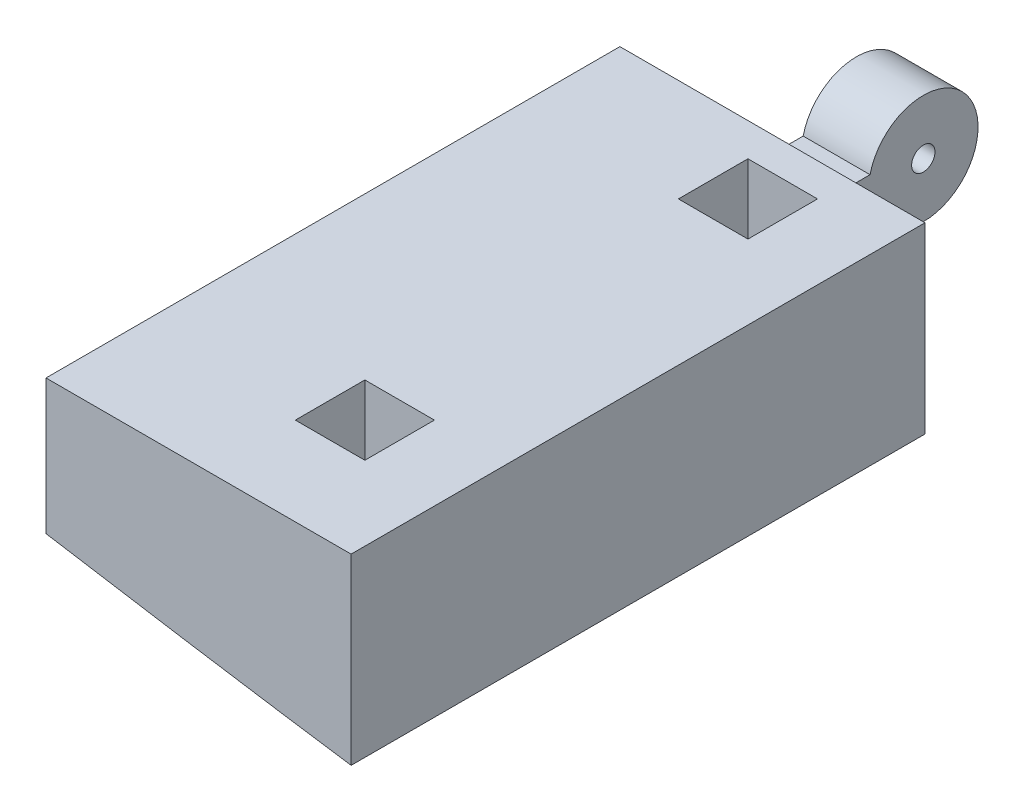
ISO-10303-21;
HEADER;
FILE_DESCRIPTION(('STEP AP214'),'2;1');
FILE_NAME('part.step','',(''),(''),'','','');
FILE_SCHEMA(('AUTOMOTIVE_DESIGN { 1 0 10303 214 1 1 1 1 }'));
ENDSEC;
DATA;
#1=APPLICATION_CONTEXT('core data for automotive mechanical design processes');
#2=APPLICATION_PROTOCOL_DEFINITION('international standard','automotive_design',2000,#1);
#3=PRODUCT_CONTEXT('',#1,'mechanical');
#4=PRODUCT('Part','Part','',(#3));
#5=PRODUCT_RELATED_PRODUCT_CATEGORY('part','',(#4));
#6=PRODUCT_DEFINITION_FORMATION('','',#4);
#7=PRODUCT_DEFINITION_CONTEXT('part definition',#1,'design');
#8=PRODUCT_DEFINITION('design','',#6,#7);
#9=PRODUCT_DEFINITION_SHAPE('','',#8);
#10=(LENGTH_UNIT() NAMED_UNIT(*) SI_UNIT(.MILLI.,.METRE.));
#11=(NAMED_UNIT(*) PLANE_ANGLE_UNIT() SI_UNIT($,.RADIAN.));
#12=(NAMED_UNIT(*) SI_UNIT($,.STERADIAN.) SOLID_ANGLE_UNIT());
#13=UNCERTAINTY_MEASURE_WITH_UNIT(LENGTH_MEASURE(1.E-05),#10,'distance_accuracy_value','');
#14=(GEOMETRIC_REPRESENTATION_CONTEXT(3) GLOBAL_UNCERTAINTY_ASSIGNED_CONTEXT((#13)) GLOBAL_UNIT_ASSIGNED_CONTEXT((#10,
#11,#12)) REPRESENTATION_CONTEXT('',''));
#15=CARTESIAN_POINT('',(0.,0.,0.));
#16=DIRECTION('',(0.,0.,1.));
#17=DIRECTION('',(1.,0.,0.));
#18=AXIS2_PLACEMENT_3D('',#15,#16,#17);
#19=CARTESIAN_POINT('',(0.,12.7,0.));
#20=DIRECTION('',(0.,1.,0.));
#21=DIRECTION('',(0.,0.,1.));
#22=AXIS2_PLACEMENT_3D('',#19,#20,#21);
#23=PLANE('',#22);
#24=DIRECTION('',(0.,0.,1.));
#25=VECTOR('',#24,1.);
#26=CARTESIAN_POINT('',(-137.2215,12.7,45.7452478));
#27=LINE('',#26,#25);
#28=CARTESIAN_POINT('',(-137.2215,12.7,39.1952478));
#29=VERTEX_POINT('',#28);
#30=CARTESIAN_POINT('',(-137.2215,12.7,45.7452478));
#31=VERTEX_POINT('',#30);
#32=EDGE_CURVE('E230',#29,#31,#27,.T.);
#33=ORIENTED_EDGE('',*,*,#32,.F.);
#34=DIRECTION('',(-1.,0.,0.));
#35=VECTOR('',#34,1.);
#36=CARTESIAN_POINT('',(-137.2215,12.7,39.1952478));
#37=LINE('',#36,#35);
#38=CARTESIAN_POINT('',(-130.6715,12.7,39.1952478));
#39=VERTEX_POINT('',#38);
#40=EDGE_CURVE('E632',#39,#29,#37,.T.);
#41=ORIENTED_EDGE('',*,*,#40,.F.);
#42=DIRECTION('',(0.,0.,-1.));
#43=VECTOR('',#42,1.);
#44=CARTESIAN_POINT('',(-130.6715,12.7,39.1952478));
#45=LINE('',#44,#43);
#46=CARTESIAN_POINT('',(-130.6715,12.7,45.7452478));
#47=VERTEX_POINT('',#46);
#48=EDGE_CURVE('E627',#47,#39,#45,.T.);
#49=ORIENTED_EDGE('',*,*,#48,.F.);
#50=DIRECTION('',(1.,0.,0.));
#51=VECTOR('',#50,1.);
#52=CARTESIAN_POINT('',(-130.6715,12.7,45.7452478));
#53=LINE('',#52,#51);
#54=EDGE_CURVE('E622',#31,#47,#53,.T.);
#55=ORIENTED_EDGE('',*,*,#54,.F.);
#56=EDGE_LOOP('',(#33,#41,#49,#55));
#57=FACE_BOUND('',#56,.T.);
#58=DIRECTION('',(0.,0.,1.));
#59=VECTOR('',#58,1.);
#60=CARTESIAN_POINT('',(-137.2215,12.7,9.6673926));
#61=LINE('',#60,#59);
#62=CARTESIAN_POINT('',(-137.2215,12.7,3.11739259999999));
#63=VERTEX_POINT('',#62);
#64=CARTESIAN_POINT('',(-137.2215,12.7,9.6673926));
#65=VERTEX_POINT('',#64);
#66=EDGE_CURVE('E99',#63,#65,#61,.T.);
#67=ORIENTED_EDGE('',*,*,#66,.F.);
#68=DIRECTION('',(-1.,0.,0.));
#69=VECTOR('',#68,1.);
#70=CARTESIAN_POINT('',(-137.2215,12.7,3.11739259999999));
#71=LINE('',#70,#69);
#72=CARTESIAN_POINT('',(-130.6715,12.7,3.11739259999999));
#73=VERTEX_POINT('',#72);
#74=EDGE_CURVE('E178',#73,#63,#71,.T.);
#75=ORIENTED_EDGE('',*,*,#74,.F.);
#76=DIRECTION('',(0.,0.,-1.));
#77=VECTOR('',#76,1.);
#78=CARTESIAN_POINT('',(-130.6715,12.7,3.11739259999999));
#79=LINE('',#78,#77);
#80=CARTESIAN_POINT('',(-130.6715,12.7,9.6673926));
#81=VERTEX_POINT('',#80);
#82=EDGE_CURVE('E614',#81,#73,#79,.T.);
#83=ORIENTED_EDGE('',*,*,#82,.F.);
#84=DIRECTION('',(1.,0.,0.));
#85=VECTOR('',#84,1.);
#86=CARTESIAN_POINT('',(-130.6715,12.7,9.6673926));
#87=LINE('',#86,#85);
#88=EDGE_CURVE('E595',#65,#81,#87,.T.);
#89=ORIENTED_EDGE('',*,*,#88,.F.);
#90=EDGE_LOOP('',(#67,#75,#83,#89));
#91=FACE_BOUND('',#90,.T.);
#92=DIRECTION('',(1.,0.,0.));
#93=VECTOR('',#92,1.);
#94=CARTESIAN_POINT('',(-159.010895789948,12.7,54.0463755324926));
#95=LINE('',#94,#93);
#96=CARTESIAN_POINT('',(-152.4,12.7,54.0463755324926));
#97=VERTEX_POINT('',#96);
#98=CARTESIAN_POINT('',(-123.666050737662,12.7,54.0463755324926));
#99=VERTEX_POINT('',#98);
#100=EDGE_CURVE('E42',#97,#99,#95,.T.);
#101=ORIENTED_EDGE('',*,*,#100,.T.);
#102=DIRECTION('',(0.,0.,-1.));
#103=VECTOR('',#102,1.);
#104=CARTESIAN_POINT('',(-123.666050737662,12.7,-20.9889922424434));
#105=LINE('',#104,#103);
#106=CARTESIAN_POINT('',(-123.666050737662,12.7,0.));
#107=VERTEX_POINT('',#106);
#108=EDGE_CURVE('E199',#99,#107,#105,.T.);
#109=ORIENTED_EDGE('',*,*,#108,.T.);
#110=DIRECTION('',(-1.,0.,0.));
#111=VECTOR('',#110,1.);
#112=CARTESIAN_POINT('',(0.,12.7,0.));
#113=LINE('',#112,#111);
#114=CARTESIAN_POINT('',(-152.4,12.7,0.));
#115=VERTEX_POINT('',#114);
#116=EDGE_CURVE('E200',#107,#115,#113,.T.);
#117=ORIENTED_EDGE('',*,*,#116,.T.);
#118=DIRECTION('',(0.,0.,1.));
#119=VECTOR('',#118,1.);
#120=CARTESIAN_POINT('',(-152.4,12.7,0.));
#121=LINE('',#120,#119);
#122=EDGE_CURVE('E203',#115,#97,#121,.T.);
#123=ORIENTED_EDGE('',*,*,#122,.T.);
#124=EDGE_LOOP('',(#101,#109,#117,#123));
#125=FACE_BOUND('',#124,.T.);
#126=ADVANCED_FACE('F38',(#57,#91,#125),#23,.T.);
#127=CARTESIAN_POINT('',(0.,12.7,0.));
#128=DIRECTION('',(0.,0.,1.));
#129=DIRECTION('',(1.,0.,0.));
#130=AXIS2_PLACEMENT_3D('',#127,#128,#129);
#131=PLANE('',#130);
#132=CARTESIAN_POINT('',(0.,0.,0.));
#133=CARTESIAN_POINT('',(-152.4,0.,0.));
#134=B_SPLINE_CURVE_WITH_KNOTS('',1,(#132,#133),.UNSPECIFIED.,.F.,.F.,(2,2),(0.,1.),.UNSPECIFIED.);
#135=CARTESIAN_POINT('',(-134.9375,0.,0.));
#136=VERTEX_POINT('',#135);
#137=CARTESIAN_POINT('',(-144.4125,0.,0.));
#138=VERTEX_POINT('',#137);
#139=EDGE_CURVE('E234',#136,#138,#134,.T.);
#140=ORIENTED_EDGE('',*,*,#139,.F.);
#141=DIRECTION('',(0.,-1.,0.));
#142=VECTOR('',#141,1.);
#143=CARTESIAN_POINT('',(-134.9375,12.7,0.));
#144=LINE('',#143,#142);
#145=CARTESIAN_POINT('',(-134.9375,7.9375,0.));
#146=VERTEX_POINT('',#145);
#147=EDGE_CURVE('E256',#136,#146,#144,.F.);
#148=ORIENTED_EDGE('',*,*,#147,.T.);
#149=DIRECTION('',(1.,0.,0.));
#150=VECTOR('',#149,1.);
#151=CARTESIAN_POINT('',(0.,7.9375,0.));
#152=LINE('',#151,#150);
#153=CARTESIAN_POINT('',(-144.4125,7.9375,0.));
#154=VERTEX_POINT('',#153);
#155=EDGE_CURVE('E254',#146,#154,#152,.F.);
#156=ORIENTED_EDGE('',*,*,#155,.T.);
#157=DIRECTION('',(0.,-1.,0.));
#158=VECTOR('',#157,1.);
#159=CARTESIAN_POINT('',(-144.4125,0.,0.));
#160=LINE('',#159,#158);
#161=EDGE_CURVE('E250',#154,#138,#160,.T.);
#162=ORIENTED_EDGE('',*,*,#161,.T.);
#163=EDGE_LOOP('',(#140,#148,#156,#162));
#164=FACE_BOUND('',#163,.T.);
#165=DIRECTION('',(0.,1.,0.));
#166=VECTOR('',#165,1.);
#167=CARTESIAN_POINT('',(-123.666050737662,12.7,0.));
#168=LINE('',#167,#166);
#169=CARTESIAN_POINT('',(-123.666050737662,-4.53284824805503,0.));
#170=VERTEX_POINT('',#169);
#171=EDGE_CURVE('E67',#170,#107,#168,.T.);
#172=ORIENTED_EDGE('',*,*,#171,.F.);
#173=CARTESIAN_POINT('',(-152.4,0.,0.));
#174=CARTESIAN_POINT('',(0.228665123043994,-25.3989706929534,0.));
#175=CARTESIAN_POINT('',(0.,0.,0.));
#176=B_SPLINE_CURVE_WITH_KNOTS('',2,(#173,#174,#175),.UNSPECIFIED.,.F.,.F.,(3,3),(0.,
0.553498681191625),.UNSPECIFIED.);
#177=CARTESIAN_POINT('',(-152.4,0.,0.));
#178=VERTEX_POINT('',#177);
#179=EDGE_CURVE('E235',#178,#170,#176,.T.);
#180=ORIENTED_EDGE('',*,*,#179,.F.);
#181=DIRECTION('',(0.,-1.,0.));
#182=VECTOR('',#181,1.);
#183=CARTESIAN_POINT('',(-152.4,12.7,0.));
#184=LINE('',#183,#182);
#185=EDGE_CURVE('E253',#115,#178,#184,.T.);
#186=ORIENTED_EDGE('',*,*,#185,.F.);
#187=ORIENTED_EDGE('',*,*,#116,.F.);
#188=EDGE_LOOP('',(#172,#180,#186,#187));
#189=FACE_BOUND('',#188,.T.);
#190=ADVANCED_FACE('F353',(#164,#189),#131,.F.);
#191=CARTESIAN_POINT('',(-152.4,12.7,0.));
#192=DIRECTION('',(1.,0.,0.));
#193=DIRECTION('',(0.,0.,-1.));
#194=AXIS2_PLACEMENT_3D('',#191,#192,#193);
#195=PLANE('',#194);
#196=DIRECTION('',(0.,-1.,0.));
#197=VECTOR('',#196,1.);
#198=CARTESIAN_POINT('',(-152.4,12.7,54.0463755324926));
#199=LINE('',#198,#197);
#200=CARTESIAN_POINT('',(-152.4,0.,54.0463755324926));
#201=VERTEX_POINT('',#200);
#202=EDGE_CURVE('E198',#97,#201,#199,.T.);
#203=ORIENTED_EDGE('',*,*,#202,.F.);
#204=ORIENTED_EDGE('',*,*,#122,.F.);
#205=ORIENTED_EDGE('',*,*,#185,.T.);
#206=DIRECTION('',(0.,0.,1.));
#207=VECTOR('',#206,1.);
#208=CARTESIAN_POINT('',(-152.4,0.,0.));
#209=LINE('',#208,#207);
#210=EDGE_CURVE('E260',#178,#201,#209,.T.);
#211=ORIENTED_EDGE('',*,*,#210,.T.);
#212=EDGE_LOOP('',(#203,#204,#205,#211));
#213=FACE_BOUND('',#212,.T.);
#214=ADVANCED_FACE('F306',(#213),#195,.F.);
#215=CARTESIAN_POINT('',(-152.4,0.,305.385177316056));
#216=CARTESIAN_POINT('',(0.228665123044032,-25.3989706929534,305.385177316056));
#217=CARTESIAN_POINT('',(0.,0.,305.385177316056));
#218=B_SPLINE_CURVE_WITH_KNOTS('',2,(#215,#216,#217),.UNSPECIFIED.,.F.,.F.,(3,3),(0.,
0.553498681191625),.UNSPECIFIED.);
#219=DIRECTION('',(0.,0.,-1.));
#220=VECTOR('',#219,1.);
#221=SURFACE_OF_LINEAR_EXTRUSION('',#218,#220);
#222=DIRECTION('',(0.,0.,-1.));
#223=VECTOR('',#222,1.);
#224=CARTESIAN_POINT('',(-123.666050737662,-4.53284824805503,76.2));
#225=LINE('',#224,#223);
#226=CARTESIAN_POINT('',(-123.666050737662,-4.53284824893766,54.0463755324926));
#227=VERTEX_POINT('',#226);
#228=EDGE_CURVE('E191',#227,#170,#225,.T.);
#229=ORIENTED_EDGE('',*,*,#228,.F.);
#230=CARTESIAN_POINT('',(-152.4,0.,54.0463755324926));
#231=CARTESIAN_POINT('',(0.228665123044001,-25.3989706929534,54.0463755324926));
#232=CARTESIAN_POINT('',(0.,0.,54.0463755324926));
#233=B_SPLINE_CURVE_WITH_KNOTS('',2,(#230,#231,#232),.UNSPECIFIED.,.F.,.F.,(3,3),(0.,
0.553498681191625),.UNSPECIFIED.);
#234=EDGE_CURVE('E48',#201,#227,#233,.T.);
#235=ORIENTED_EDGE('',*,*,#234,.F.);
#236=ORIENTED_EDGE('',*,*,#210,.F.);
#237=ORIENTED_EDGE('',*,*,#179,.T.);
#238=EDGE_LOOP('',(#229,#235,#236,#237));
#239=FACE_BOUND('',#238,.T.);
#240=ADVANCED_FACE('F301',(#239),#221,.F.);
#241=CARTESIAN_POINT('',(0.,0.,0.));
#242=DIRECTION('',(0.,1.,0.));
#243=DIRECTION('',(0.,0.,1.));
#244=AXIS2_PLACEMENT_3D('',#241,#242,#243);
#245=PLANE('',#244);
#246=CARTESIAN_POINT('',(-134.9375,0.,-1.58749999999998));
#247=DIRECTION('',(0.,1.,0.));
#248=DIRECTION('',(0.,0.,1.));
#249=AXIS2_PLACEMENT_3D('',#246,#247,#248);
#250=CIRCLE('',#249,1.5875);
#251=CARTESIAN_POINT('',(-136.525,0.,-1.58749999999998));
#252=VERTEX_POINT('',#251);
#253=EDGE_CURVE('E231',#252,#136,#250,.T.);
#254=ORIENTED_EDGE('',*,*,#253,.T.);
#255=ORIENTED_EDGE('',*,*,#139,.T.);
#256=CARTESIAN_POINT('',(-144.4125,0.,-1.58749999999998));
#257=DIRECTION('',(0.,1.,0.));
#258=DIRECTION('',(0.,0.,1.));
#259=AXIS2_PLACEMENT_3D('',#256,#257,#258);
#260=CIRCLE('',#259,1.5875);
#261=CARTESIAN_POINT('',(-142.825,0.,-1.58749999999998));
#262=VERTEX_POINT('',#261);
#263=EDGE_CURVE('E236',#138,#262,#260,.T.);
#264=ORIENTED_EDGE('',*,*,#263,.T.);
#265=DIRECTION('',(0.,0.,-1.));
#266=VECTOR('',#265,1.);
#267=CARTESIAN_POINT('',(-142.825,0.,0.));
#268=LINE('',#267,#266);
#269=CARTESIAN_POINT('',(-142.825,0.,-12.7));
#270=VERTEX_POINT('',#269);
#271=EDGE_CURVE('E238',#262,#270,#268,.T.);
#272=ORIENTED_EDGE('',*,*,#271,.T.);
#273=DIRECTION('',(1.,0.,0.));
#274=VECTOR('',#273,1.);
#275=CARTESIAN_POINT('',(-142.825,0.,-12.7));
#276=LINE('',#275,#274);
#277=CARTESIAN_POINT('',(-136.525,0.,-12.7));
#278=VERTEX_POINT('',#277);
#279=EDGE_CURVE('E264',#270,#278,#276,.T.);
#280=ORIENTED_EDGE('',*,*,#279,.T.);
#281=DIRECTION('',(0.,0.,-1.));
#282=VECTOR('',#281,1.);
#283=CARTESIAN_POINT('',(-136.525,0.,0.));
#284=LINE('',#283,#282);
#285=EDGE_CURVE('E241',#252,#278,#284,.T.);
#286=ORIENTED_EDGE('',*,*,#285,.F.);
#287=EDGE_LOOP('',(#254,#255,#264,#272,#280,#286));
#288=FACE_BOUND('',#287,.T.);
#289=ADVANCED_FACE('F305',(#288),#245,.F.);
#290=CARTESIAN_POINT('',(-142.825,6.35,0.));
#291=DIRECTION('',(0.,1.,0.));
#292=DIRECTION('',(0.,0.,1.));
#293=AXIS2_PLACEMENT_3D('',#290,#291,#292);
#294=PLANE('',#293);
#295=DIRECTION('',(0.,0.,1.));
#296=VECTOR('',#295,1.);
#297=CARTESIAN_POINT('',(-142.825,6.35,0.));
#298=LINE('',#297,#296);
#299=CARTESIAN_POINT('',(-142.825,6.35,-7.68390191483458));
#300=VERTEX_POINT('',#299);
#301=CARTESIAN_POINT('',(-142.825,6.35,-1.58749999999998));
#302=VERTEX_POINT('',#301);
#303=EDGE_CURVE('E246',#300,#302,#298,.T.);
#304=ORIENTED_EDGE('',*,*,#303,.T.);
#305=DIRECTION('',(1.,0.,0.));
#306=VECTOR('',#305,1.);
#307=CARTESIAN_POINT('',(-142.825,6.35,-1.58749999999998));
#308=LINE('',#307,#306);
#309=CARTESIAN_POINT('',(-136.525,6.35,-1.58749999999998));
#310=VERTEX_POINT('',#309);
#311=EDGE_CURVE('E243',#302,#310,#308,.T.);
#312=ORIENTED_EDGE('',*,*,#311,.T.);
#313=DIRECTION('',(0.,0.,1.));
#314=VECTOR('',#313,1.);
#315=CARTESIAN_POINT('',(-136.525,6.35,0.));
#316=LINE('',#315,#314);
#317=CARTESIAN_POINT('',(-136.525,6.35,-7.68390191483458));
#318=VERTEX_POINT('',#317);
#319=EDGE_CURVE('E242',#318,#310,#316,.T.);
#320=ORIENTED_EDGE('',*,*,#319,.F.);
#321=DIRECTION('',(1.,0.,0.));
#322=VECTOR('',#321,1.);
#323=CARTESIAN_POINT('',(-142.825,6.35,-7.68390191483458));
#324=LINE('',#323,#322);
#325=EDGE_CURVE('E249',#300,#318,#324,.T.);
#326=ORIENTED_EDGE('',*,*,#325,.F.);
#327=EDGE_LOOP('',(#304,#312,#320,#326));
#328=FACE_BOUND('',#327,.T.);
#329=ADVANCED_FACE('F369',(#328),#294,.T.);
#330=CARTESIAN_POINT('',(-142.825,5.1562,-12.7));
#331=DIRECTION('',(1.,0.,0.));
#332=DIRECTION('',(0.,0.,-1.));
#333=AXIS2_PLACEMENT_3D('',#330,#331,#332);
#334=CYLINDRICAL_SURFACE('',#333,5.1562);
#335=CARTESIAN_POINT('',(-136.525,5.1562,-12.7));
#336=DIRECTION('',(1.,0.,0.));
#337=DIRECTION('',(0.,0.,-1.));
#338=AXIS2_PLACEMENT_3D('',#335,#336,#337);
#339=CIRCLE('',#338,5.1562);
#340=EDGE_CURVE('E227',#278,#318,#339,.T.);
#341=ORIENTED_EDGE('',*,*,#340,.F.);
#342=ORIENTED_EDGE('',*,*,#279,.F.);
#343=CARTESIAN_POINT('',(-142.825,5.1562,-12.7));
#344=DIRECTION('',(1.,0.,0.));
#345=DIRECTION('',(0.,0.,-1.));
#346=AXIS2_PLACEMENT_3D('',#343,#344,#345);
#347=CIRCLE('',#346,5.1562);
#348=EDGE_CURVE('E245',#270,#300,#347,.T.);
#349=ORIENTED_EDGE('',*,*,#348,.T.);
#350=ORIENTED_EDGE('',*,*,#325,.T.);
#351=EDGE_LOOP('',(#341,#342,#349,#350));
#352=FACE_BOUND('',#351,.T.);
#353=ADVANCED_FACE('F366',(#352),#334,.T.);
#354=CARTESIAN_POINT('',(-142.825,0.,0.));
#355=DIRECTION('',(1.,0.,0.));
#356=DIRECTION('',(0.,0.,-1.));
#357=AXIS2_PLACEMENT_3D('',#354,#355,#356);
#358=PLANE('',#357);
#359=CARTESIAN_POINT('',(-142.825,5.1562,-12.7));
#360=DIRECTION('',(1.,0.,0.));
#361=DIRECTION('',(0.,0.,-1.));
#362=AXIS2_PLACEMENT_3D('',#359,#360,#361);
#363=CIRCLE('',#362,1.1);
#364=CARTESIAN_POINT('',(-142.825,5.1562,-13.8));
#365=VERTEX_POINT('',#364);
#366=EDGE_CURVE('E205',#365,#365,#363,.T.);
#367=ORIENTED_EDGE('',*,*,#366,.T.);
#368=EDGE_LOOP('',(#367));
#369=FACE_BOUND('',#368,.T.);
#370=ORIENTED_EDGE('',*,*,#271,.F.);
#371=DIRECTION('',(0.,-1.,0.));
#372=VECTOR('',#371,1.);
#373=CARTESIAN_POINT('',(-142.825,6.35,-1.58749999999998));
#374=LINE('',#373,#372);
#375=EDGE_CURVE('E247',#262,#302,#374,.F.);
#376=ORIENTED_EDGE('',*,*,#375,.T.);
#377=ORIENTED_EDGE('',*,*,#303,.F.);
#378=ORIENTED_EDGE('',*,*,#348,.F.);
#379=EDGE_LOOP('',(#370,#376,#377,#378));
#380=FACE_BOUND('',#379,.T.);
#381=ADVANCED_FACE('F308',(#369,#380),#358,.F.);
#382=CARTESIAN_POINT('',(-136.525,0.,0.));
#383=DIRECTION('',(1.,0.,0.));
#384=DIRECTION('',(0.,0.,-1.));
#385=AXIS2_PLACEMENT_3D('',#382,#383,#384);
#386=PLANE('',#385);
#387=CARTESIAN_POINT('',(-136.525,5.1562,-12.7));
#388=DIRECTION('',(1.,0.,0.));
#389=DIRECTION('',(0.,0.,-1.));
#390=AXIS2_PLACEMENT_3D('',#387,#388,#389);
#391=CIRCLE('',#390,1.1);
#392=CARTESIAN_POINT('',(-136.525,5.1562,-13.8));
#393=VERTEX_POINT('',#392);
#394=EDGE_CURVE('E208',#393,#393,#391,.T.);
#395=ORIENTED_EDGE('',*,*,#394,.F.);
#396=EDGE_LOOP('',(#395));
#397=FACE_BOUND('',#396,.T.);
#398=ORIENTED_EDGE('',*,*,#319,.T.);
#399=DIRECTION('',(0.,-1.,0.));
#400=VECTOR('',#399,1.);
#401=CARTESIAN_POINT('',(-136.525,0.,-1.58749999999998));
#402=LINE('',#401,#400);
#403=EDGE_CURVE('E239',#310,#252,#402,.T.);
#404=ORIENTED_EDGE('',*,*,#403,.T.);
#405=ORIENTED_EDGE('',*,*,#285,.T.);
#406=ORIENTED_EDGE('',*,*,#340,.T.);
#407=EDGE_LOOP('',(#398,#404,#405,#406));
#408=FACE_BOUND('',#407,.T.);
#409=ADVANCED_FACE('F373',(#397,#408),#386,.T.);
#410=CARTESIAN_POINT('',(-134.9375,0.,-1.58749999999998));
#411=DIRECTION('',(0.,-1.,0.));
#412=DIRECTION('',(0.,0.,-1.));
#413=AXIS2_PLACEMENT_3D('',#410,#411,#412);
#414=CYLINDRICAL_SURFACE('',#413,1.5875);
#415=ORIENTED_EDGE('',*,*,#253,.F.);
#416=ORIENTED_EDGE('',*,*,#403,.F.);
#417=CARTESIAN_POINT('',(-134.9375,7.9375,-1.58749999999998));
#418=DIRECTION('',(0.707106781186547,-0.707106781186547,0.));
#419=DIRECTION('',(-0.707106781186547,-0.707106781186547,0.));
#420=AXIS2_PLACEMENT_3D('',#417,#418,#419);
#421=ELLIPSE('',#420,2.24506403026729,1.5875);
#422=EDGE_CURVE('E220',#146,#310,#421,.T.);
#423=ORIENTED_EDGE('',*,*,#422,.F.);
#424=ORIENTED_EDGE('',*,*,#147,.F.);
#425=EDGE_LOOP('',(#415,#416,#423,#424));
#426=FACE_BOUND('',#425,.T.);
#427=ADVANCED_FACE('F375',(#426),#414,.F.);
#428=CARTESIAN_POINT('',(-142.825,7.9375,-1.58749999999998));
#429=DIRECTION('',(1.,0.,0.));
#430=DIRECTION('',(0.,0.,-1.));
#431=AXIS2_PLACEMENT_3D('',#428,#429,#430);
#432=CYLINDRICAL_SURFACE('',#431,1.5875);
#433=ORIENTED_EDGE('',*,*,#422,.T.);
#434=ORIENTED_EDGE('',*,*,#311,.F.);
#435=CARTESIAN_POINT('',(-144.4125,7.9375,-1.58749999999998));
#436=DIRECTION('',(0.707106781186547,0.707106781186547,0.));
#437=DIRECTION('',(0.707106781186547,-0.707106781186547,0.));
#438=AXIS2_PLACEMENT_3D('',#435,#436,#437);
#439=ELLIPSE('',#438,2.24506403026729,1.5875);
#440=EDGE_CURVE('E226',#154,#302,#439,.T.);
#441=ORIENTED_EDGE('',*,*,#440,.F.);
#442=ORIENTED_EDGE('',*,*,#155,.F.);
#443=EDGE_LOOP('',(#433,#434,#441,#442));
#444=FACE_BOUND('',#443,.T.);
#445=ADVANCED_FACE('F382',(#444),#432,.F.);
#446=CARTESIAN_POINT('',(-144.4125,12.7,-1.58749999999998));
#447=DIRECTION('',(0.,1.,0.));
#448=DIRECTION('',(0.,0.,1.));
#449=AXIS2_PLACEMENT_3D('',#446,#447,#448);
#450=CYLINDRICAL_SURFACE('',#449,1.5875);
#451=ORIENTED_EDGE('',*,*,#440,.T.);
#452=ORIENTED_EDGE('',*,*,#375,.F.);
#453=ORIENTED_EDGE('',*,*,#263,.F.);
#454=ORIENTED_EDGE('',*,*,#161,.F.);
#455=EDGE_LOOP('',(#451,#452,#453,#454));
#456=FACE_BOUND('',#455,.T.);
#457=ADVANCED_FACE('F314',(#456),#450,.F.);
#458=CARTESIAN_POINT('',(-137.2215,5.08,45.7452478));
#459=DIRECTION('',(-1.,0.,0.));
#460=DIRECTION('',(0.,0.,1.));
#461=AXIS2_PLACEMENT_3D('',#458,#459,#460);
#462=PLANE('',#461);
#463=ORIENTED_EDGE('',*,*,#32,.T.);
#464=DIRECTION('',(0.,1.,0.));
#465=VECTOR('',#464,1.);
#466=CARTESIAN_POINT('',(-137.2215,5.08,45.7452478));
#467=LINE('',#466,#465);
#468=CARTESIAN_POINT('',(-137.2215,5.08,45.7452478));
#469=VERTEX_POINT('',#468);
#470=EDGE_CURVE('E295',#469,#31,#467,.T.);
#471=ORIENTED_EDGE('',*,*,#470,.F.);
#472=DIRECTION('',(0.,0.,1.));
#473=VECTOR('',#472,1.);
#474=CARTESIAN_POINT('',(-137.2215,5.08,45.7452478));
#475=LINE('',#474,#473);
#476=CARTESIAN_POINT('',(-137.2215,5.08,39.1952478));
#477=VERTEX_POINT('',#476);
#478=EDGE_CURVE('E610',#477,#469,#475,.T.);
#479=ORIENTED_EDGE('',*,*,#478,.F.);
#480=DIRECTION('',(0.,1.,0.));
#481=VECTOR('',#480,1.);
#482=CARTESIAN_POINT('',(-137.2215,5.08,39.1952478));
#483=LINE('',#482,#481);
#484=EDGE_CURVE('E635',#477,#29,#483,.T.);
#485=ORIENTED_EDGE('',*,*,#484,.T.);
#486=EDGE_LOOP('',(#463,#471,#479,#485));
#487=FACE_BOUND('',#486,.T.);
#488=ADVANCED_FACE('F310',(#487),#462,.F.);
#489=CARTESIAN_POINT('',(-137.2215,5.08,39.1952478));
#490=DIRECTION('',(0.,0.,-1.));
#491=DIRECTION('',(-1.,0.,0.));
#492=AXIS2_PLACEMENT_3D('',#489,#490,#491);
#493=PLANE('',#492);
#494=ORIENTED_EDGE('',*,*,#40,.T.);
#495=ORIENTED_EDGE('',*,*,#484,.F.);
#496=DIRECTION('',(-1.,0.,0.));
#497=VECTOR('',#496,1.);
#498=CARTESIAN_POINT('',(-137.2215,5.08,39.1952478));
#499=LINE('',#498,#497);
#500=CARTESIAN_POINT('',(-130.6715,5.08,39.1952478));
#501=VERTEX_POINT('',#500);
#502=EDGE_CURVE('E596',#501,#477,#499,.T.);
#503=ORIENTED_EDGE('',*,*,#502,.F.);
#504=DIRECTION('',(0.,1.,0.));
#505=VECTOR('',#504,1.);
#506=CARTESIAN_POINT('',(-130.6715,5.08,39.1952478));
#507=LINE('',#506,#505);
#508=EDGE_CURVE('E631',#501,#39,#507,.T.);
#509=ORIENTED_EDGE('',*,*,#508,.T.);
#510=EDGE_LOOP('',(#494,#495,#503,#509));
#511=FACE_BOUND('',#510,.T.);
#512=ADVANCED_FACE('F313',(#511),#493,.F.);
#513=CARTESIAN_POINT('',(-130.6715,5.08,39.1952478));
#514=DIRECTION('',(1.,0.,0.));
#515=DIRECTION('',(0.,0.,-1.));
#516=AXIS2_PLACEMENT_3D('',#513,#514,#515);
#517=PLANE('',#516);
#518=ORIENTED_EDGE('',*,*,#48,.T.);
#519=ORIENTED_EDGE('',*,*,#508,.F.);
#520=DIRECTION('',(0.,0.,-1.));
#521=VECTOR('',#520,1.);
#522=CARTESIAN_POINT('',(-130.6715,5.08,39.1952478));
#523=LINE('',#522,#521);
#524=CARTESIAN_POINT('',(-130.6715,5.08,45.7452478));
#525=VERTEX_POINT('',#524);
#526=EDGE_CURVE('E598',#525,#501,#523,.T.);
#527=ORIENTED_EDGE('',*,*,#526,.F.);
#528=DIRECTION('',(0.,1.,0.));
#529=VECTOR('',#528,1.);
#530=CARTESIAN_POINT('',(-130.6715,5.08,45.7452478));
#531=LINE('',#530,#529);
#532=EDGE_CURVE('E625',#525,#47,#531,.T.);
#533=ORIENTED_EDGE('',*,*,#532,.T.);
#534=EDGE_LOOP('',(#518,#519,#527,#533));
#535=FACE_BOUND('',#534,.T.);
#536=ADVANCED_FACE('F320',(#535),#517,.F.);
#537=CARTESIAN_POINT('',(-130.6715,5.08,45.7452478));
#538=DIRECTION('',(0.,0.,1.));
#539=DIRECTION('',(1.,0.,0.));
#540=AXIS2_PLACEMENT_3D('',#537,#538,#539);
#541=PLANE('',#540);
#542=ORIENTED_EDGE('',*,*,#54,.T.);
#543=ORIENTED_EDGE('',*,*,#532,.F.);
#544=DIRECTION('',(1.,0.,0.));
#545=VECTOR('',#544,1.);
#546=CARTESIAN_POINT('',(-130.6715,5.08,45.7452478));
#547=LINE('',#546,#545);
#548=EDGE_CURVE('E603',#469,#525,#547,.T.);
#549=ORIENTED_EDGE('',*,*,#548,.F.);
#550=ORIENTED_EDGE('',*,*,#470,.T.);
#551=EDGE_LOOP('',(#542,#543,#549,#550));
#552=FACE_BOUND('',#551,.T.);
#553=ADVANCED_FACE('F316',(#552),#541,.F.);
#554=CARTESIAN_POINT('',(0.,5.08,0.));
#555=DIRECTION('',(0.,-1.,0.));
#556=DIRECTION('',(0.,0.,-1.));
#557=AXIS2_PLACEMENT_3D('',#554,#555,#556);
#558=PLANE('',#557);
#559=ORIENTED_EDGE('',*,*,#478,.T.);
#560=ORIENTED_EDGE('',*,*,#548,.T.);
#561=ORIENTED_EDGE('',*,*,#526,.T.);
#562=ORIENTED_EDGE('',*,*,#502,.T.);
#563=EDGE_LOOP('',(#559,#560,#561,#562));
#564=FACE_BOUND('',#563,.T.);
#565=ADVANCED_FACE('F319',(#564),#558,.F.);
#566=CARTESIAN_POINT('',(-137.2215,5.08,9.6673926));
#567=DIRECTION('',(-1.,0.,0.));
#568=DIRECTION('',(0.,0.,1.));
#569=AXIS2_PLACEMENT_3D('',#566,#567,#568);
#570=PLANE('',#569);
#571=ORIENTED_EDGE('',*,*,#66,.T.);
#572=DIRECTION('',(0.,1.,0.));
#573=VECTOR('',#572,1.);
#574=CARTESIAN_POINT('',(-137.2215,5.08,9.6673926));
#575=LINE('',#574,#573);
#576=CARTESIAN_POINT('',(-137.2215,5.08,9.6673926));
#577=VERTEX_POINT('',#576);
#578=EDGE_CURVE('E92',#577,#65,#575,.T.);
#579=ORIENTED_EDGE('',*,*,#578,.F.);
#580=DIRECTION('',(0.,0.,1.));
#581=VECTOR('',#580,1.);
#582=CARTESIAN_POINT('',(-137.2215,5.08,9.6673926));
#583=LINE('',#582,#581);
#584=CARTESIAN_POINT('',(-137.2215,5.08,3.11739259999999));
#585=VERTEX_POINT('',#584);
#586=EDGE_CURVE('E181',#585,#577,#583,.T.);
#587=ORIENTED_EDGE('',*,*,#586,.F.);
#588=DIRECTION('',(0.,1.,0.));
#589=VECTOR('',#588,1.);
#590=CARTESIAN_POINT('',(-137.2215,5.08,3.11739259999999));
#591=LINE('',#590,#589);
#592=EDGE_CURVE('E173',#585,#63,#591,.T.);
#593=ORIENTED_EDGE('',*,*,#592,.T.);
#594=EDGE_LOOP('',(#571,#579,#587,#593));
#595=FACE_BOUND('',#594,.T.);
#596=ADVANCED_FACE('F182',(#595),#570,.F.);
#597=CARTESIAN_POINT('',(-137.2215,5.08,3.11739259999999));
#598=DIRECTION('',(0.,0.,-1.));
#599=DIRECTION('',(-1.,0.,0.));
#600=AXIS2_PLACEMENT_3D('',#597,#598,#599);
#601=PLANE('',#600);
#602=ORIENTED_EDGE('',*,*,#74,.T.);
#603=ORIENTED_EDGE('',*,*,#592,.F.);
#604=DIRECTION('',(-1.,0.,0.));
#605=VECTOR('',#604,1.);
#606=CARTESIAN_POINT('',(-137.2215,5.08,3.11739259999999));
#607=LINE('',#606,#605);
#608=CARTESIAN_POINT('',(-130.6715,5.08,3.11739259999999));
#609=VERTEX_POINT('',#608);
#610=EDGE_CURVE('E176',#609,#585,#607,.T.);
#611=ORIENTED_EDGE('',*,*,#610,.F.);
#612=DIRECTION('',(0.,1.,0.));
#613=VECTOR('',#612,1.);
#614=CARTESIAN_POINT('',(-130.6715,5.08,3.11739259999999));
#615=LINE('',#614,#613);
#616=EDGE_CURVE('E615',#609,#73,#615,.T.);
#617=ORIENTED_EDGE('',*,*,#616,.T.);
#618=EDGE_LOOP('',(#602,#603,#611,#617));
#619=FACE_BOUND('',#618,.T.);
#620=ADVANCED_FACE('F174',(#619),#601,.F.);
#621=CARTESIAN_POINT('',(-130.6715,5.08,3.11739259999999));
#622=DIRECTION('',(1.,0.,0.));
#623=DIRECTION('',(0.,0.,-1.));
#624=AXIS2_PLACEMENT_3D('',#621,#622,#623);
#625=PLANE('',#624);
#626=ORIENTED_EDGE('',*,*,#82,.T.);
#627=ORIENTED_EDGE('',*,*,#616,.F.);
#628=DIRECTION('',(0.,0.,-1.));
#629=VECTOR('',#628,1.);
#630=CARTESIAN_POINT('',(-130.6715,5.08,3.11739259999999));
#631=LINE('',#630,#629);
#632=CARTESIAN_POINT('',(-130.6715,5.08,9.6673926));
#633=VERTEX_POINT('',#632);
#634=EDGE_CURVE('E189',#633,#609,#631,.T.);
#635=ORIENTED_EDGE('',*,*,#634,.F.);
#636=DIRECTION('',(0.,1.,0.));
#637=VECTOR('',#636,1.);
#638=CARTESIAN_POINT('',(-130.6715,5.08,9.6673926));
#639=LINE('',#638,#637);
#640=EDGE_CURVE('E77',#633,#81,#639,.T.);
#641=ORIENTED_EDGE('',*,*,#640,.T.);
#642=EDGE_LOOP('',(#626,#627,#635,#641));
#643=FACE_BOUND('',#642,.T.);
#644=ADVANCED_FACE('F336',(#643),#625,.F.);
#645=CARTESIAN_POINT('',(-130.6715,5.08,9.6673926));
#646=DIRECTION('',(0.,0.,1.));
#647=DIRECTION('',(1.,0.,0.));
#648=AXIS2_PLACEMENT_3D('',#645,#646,#647);
#649=PLANE('',#648);
#650=ORIENTED_EDGE('',*,*,#88,.T.);
#651=ORIENTED_EDGE('',*,*,#640,.F.);
#652=DIRECTION('',(1.,0.,0.));
#653=VECTOR('',#652,1.);
#654=CARTESIAN_POINT('',(-130.6715,5.08,9.6673926));
#655=LINE('',#654,#653);
#656=EDGE_CURVE('E185',#577,#633,#655,.T.);
#657=ORIENTED_EDGE('',*,*,#656,.F.);
#658=ORIENTED_EDGE('',*,*,#578,.T.);
#659=EDGE_LOOP('',(#650,#651,#657,#658));
#660=FACE_BOUND('',#659,.T.);
#661=ADVANCED_FACE('F333',(#660),#649,.F.);
#662=CARTESIAN_POINT('',(0.,5.08,0.));
#663=DIRECTION('',(0.,-1.,0.));
#664=DIRECTION('',(0.,0.,-1.));
#665=AXIS2_PLACEMENT_3D('',#662,#663,#664);
#666=PLANE('',#665);
#667=ORIENTED_EDGE('',*,*,#586,.T.);
#668=ORIENTED_EDGE('',*,*,#656,.T.);
#669=ORIENTED_EDGE('',*,*,#634,.T.);
#670=ORIENTED_EDGE('',*,*,#610,.T.);
#671=EDGE_LOOP('',(#667,#668,#669,#670));
#672=FACE_BOUND('',#671,.T.);
#673=ADVANCED_FACE('F188',(#672),#666,.F.);
#674=CARTESIAN_POINT('',(-123.666050737662,-14.1736812368517,-20.9889922424434));
#675=DIRECTION('',(1.,0.,0.));
#676=DIRECTION('',(0.,0.,-1.));
#677=AXIS2_PLACEMENT_3D('',#674,#675,#676);
#678=PLANE('',#677);
#679=ORIENTED_EDGE('',*,*,#171,.T.);
#680=ORIENTED_EDGE('',*,*,#108,.F.);
#681=DIRECTION('',(0.,1.,0.));
#682=VECTOR('',#681,1.);
#683=CARTESIAN_POINT('',(-123.666050737662,-14.1736812368517,54.0463755324926));
#684=LINE('',#683,#682);
#685=EDGE_CURVE('E12',#227,#99,#684,.T.);
#686=ORIENTED_EDGE('',*,*,#685,.F.);
#687=ORIENTED_EDGE('',*,*,#228,.T.);
#688=EDGE_LOOP('',(#679,#680,#686,#687));
#689=FACE_BOUND('',#688,.T.);
#690=ADVANCED_FACE('F40',(#689),#678,.T.);
#691=CARTESIAN_POINT('',(-159.010895789948,-14.1736812368517,54.0463755324926));
#692=DIRECTION('',(0.,0.,1.));
#693=DIRECTION('',(1.,0.,0.));
#694=AXIS2_PLACEMENT_3D('',#691,#692,#693);
#695=PLANE('',#694);
#696=ORIENTED_EDGE('',*,*,#202,.T.);
#697=ORIENTED_EDGE('',*,*,#234,.T.);
#698=ORIENTED_EDGE('',*,*,#685,.T.);
#699=ORIENTED_EDGE('',*,*,#100,.F.);
#700=EDGE_LOOP('',(#696,#697,#698,#699));
#701=FACE_BOUND('',#700,.T.);
#702=ADVANCED_FACE('F343',(#701),#695,.T.);
#703=CARTESIAN_POINT('',(-152.4,5.1562,-12.7));
#704=DIRECTION('',(1.,0.,0.));
#705=DIRECTION('',(0.,0.,-1.));
#706=AXIS2_PLACEMENT_3D('',#703,#704,#705);
#707=CYLINDRICAL_SURFACE('',#706,1.1);
#708=ORIENTED_EDGE('',*,*,#394,.T.);
#709=EDGE_LOOP('',(#708));
#710=FACE_BOUND('',#709,.T.);
#711=ORIENTED_EDGE('',*,*,#366,.F.);
#712=EDGE_LOOP('',(#711));
#713=FACE_BOUND('',#712,.T.);
#714=ADVANCED_FACE('F345',(#710,#713),#707,.F.);
#715=CLOSED_SHELL('',(#126,#190,#214,#240,#289,#329,#353,#381,#409,#427,#445,#457,#488,#512,
#536,#553,#565,#596,#620,#644,#661,#673,#690,#702,#714));
#716=MANIFOLD_SOLID_BREP('B2',#715);
#717=ADVANCED_BREP_SHAPE_REPRESENTATION('',(#18,#716),#14);
#718=SHAPE_DEFINITION_REPRESENTATION(#9,#717);
ENDSEC;
END-ISO-10303-21;
